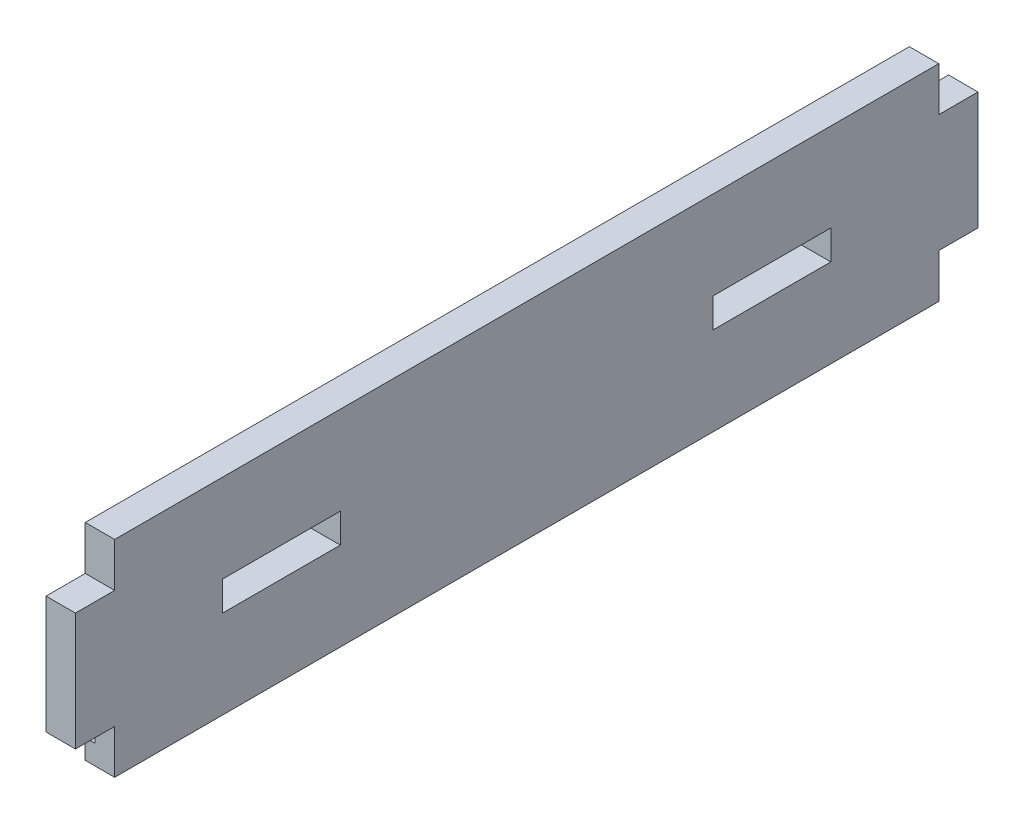
ISO-10303-21;
HEADER;
FILE_DESCRIPTION(('STEP AP214'),'2;1');
FILE_NAME('part.step','',(''),(''),'','','');
FILE_SCHEMA(('AUTOMOTIVE_DESIGN { 1 0 10303 214 1 1 1 1 }'));
ENDSEC;
DATA;
#1=APPLICATION_CONTEXT('core data for automotive mechanical design processes');
#2=APPLICATION_PROTOCOL_DEFINITION('international standard','automotive_design',2000,#1);
#3=PRODUCT_CONTEXT('',#1,'mechanical');
#4=PRODUCT('Part','Part','',(#3));
#5=PRODUCT_RELATED_PRODUCT_CATEGORY('part','',(#4));
#6=PRODUCT_DEFINITION_FORMATION('','',#4);
#7=PRODUCT_DEFINITION_CONTEXT('part definition',#1,'design');
#8=PRODUCT_DEFINITION('design','',#6,#7);
#9=PRODUCT_DEFINITION_SHAPE('','',#8);
#10=(LENGTH_UNIT() NAMED_UNIT(*) SI_UNIT(.MILLI.,.METRE.));
#11=(NAMED_UNIT(*) PLANE_ANGLE_UNIT() SI_UNIT($,.RADIAN.));
#12=(NAMED_UNIT(*) SI_UNIT($,.STERADIAN.) SOLID_ANGLE_UNIT());
#13=UNCERTAINTY_MEASURE_WITH_UNIT(LENGTH_MEASURE(1.E-05),#10,'distance_accuracy_value','');
#14=(GEOMETRIC_REPRESENTATION_CONTEXT(3) GLOBAL_UNCERTAINTY_ASSIGNED_CONTEXT((#13)) GLOBAL_UNIT_ASSIGNED_CONTEXT((#10,
#11,#12)) REPRESENTATION_CONTEXT('',''));
#15=CARTESIAN_POINT('',(0.,0.,0.));
#16=DIRECTION('',(0.,0.,1.));
#17=DIRECTION('',(1.,0.,0.));
#18=AXIS2_PLACEMENT_3D('',#15,#16,#17);
#19=CARTESIAN_POINT('',(49060.4061421849,709.389387363081,584.2));
#20=DIRECTION('',(1.,0.,0.));
#21=DIRECTION('',(0.,0.,-1.));
#22=AXIS2_PLACEMENT_3D('',#19,#20,#21);
#23=PLANE('',#22);
#24=DIRECTION('',(0.,0.,1.));
#25=VECTOR('',#24,1.);
#26=CARTESIAN_POINT('',(49060.4061421849,633.189387363082,95.25));
#27=LINE('',#26,#25);
#28=CARTESIAN_POINT('',(49060.4061421849,633.189387363082,95.25));
#29=VERTEX_POINT('',#28);
#30=CARTESIAN_POINT('',(49060.4061421849,633.189387363082,171.45));
#31=VERTEX_POINT('',#30);
#32=EDGE_CURVE('E324',#29,#31,#27,.T.);
#33=ORIENTED_EDGE('',*,*,#32,.F.);
#34=DIRECTION('',(0.,-1.,0.));
#35=VECTOR('',#34,1.);
#36=CARTESIAN_POINT('',(49060.4061421849,652.239387363081,95.25));
#37=LINE('',#36,#35);
#38=CARTESIAN_POINT('',(49060.4061421849,652.239387363081,95.25));
#39=VERTEX_POINT('',#38);
#40=EDGE_CURVE('E301',#39,#29,#37,.T.);
#41=ORIENTED_EDGE('',*,*,#40,.F.);
#42=DIRECTION('',(0.,0.,-1.));
#43=VECTOR('',#42,1.);
#44=CARTESIAN_POINT('',(49060.4061421849,652.239387363081,95.25));
#45=LINE('',#44,#43);
#46=CARTESIAN_POINT('',(49060.4061421849,652.239387363081,171.45));
#47=VERTEX_POINT('',#46);
#48=EDGE_CURVE('E313',#47,#39,#45,.T.);
#49=ORIENTED_EDGE('',*,*,#48,.F.);
#50=DIRECTION('',(0.,1.,0.));
#51=VECTOR('',#50,1.);
#52=CARTESIAN_POINT('',(49060.4061421849,652.239387363081,171.45));
#53=LINE('',#52,#51);
#54=EDGE_CURVE('E328',#31,#47,#53,.T.);
#55=ORIENTED_EDGE('',*,*,#54,.F.);
#56=EDGE_LOOP('',(#33,#41,#49,#55));
#57=FACE_BOUND('',#56,.T.);
#58=DIRECTION('',(0.,-1.,0.));
#59=VECTOR('',#58,1.);
#60=CARTESIAN_POINT('',(49060.4061421849,652.239387363081,412.75));
#61=LINE('',#60,#59);
#62=CARTESIAN_POINT('',(49060.4061421849,652.239387363081,412.75));
#63=VERTEX_POINT('',#62);
#64=CARTESIAN_POINT('',(49060.4061421849,633.189387363082,412.75));
#65=VERTEX_POINT('',#64);
#66=EDGE_CURVE('E290',#63,#65,#61,.T.);
#67=ORIENTED_EDGE('',*,*,#66,.F.);
#68=DIRECTION('',(0.,0.,-1.));
#69=VECTOR('',#68,1.);
#70=CARTESIAN_POINT('',(49060.4061421849,652.239387363081,488.95));
#71=LINE('',#70,#69);
#72=CARTESIAN_POINT('',(49060.4061421849,652.239387363081,488.95));
#73=VERTEX_POINT('',#72);
#74=EDGE_CURVE('E270',#73,#63,#71,.T.);
#75=ORIENTED_EDGE('',*,*,#74,.F.);
#76=DIRECTION('',(0.,1.,0.));
#77=VECTOR('',#76,1.);
#78=CARTESIAN_POINT('',(49060.4061421849,652.239387363081,488.95));
#79=LINE('',#78,#77);
#80=CARTESIAN_POINT('',(49060.4061421849,633.189387363082,488.95));
#81=VERTEX_POINT('',#80);
#82=EDGE_CURVE('E278',#81,#73,#79,.T.);
#83=ORIENTED_EDGE('',*,*,#82,.F.);
#84=DIRECTION('',(0.,0.,1.));
#85=VECTOR('',#84,1.);
#86=CARTESIAN_POINT('',(49060.4061421849,633.189387363082,488.95));
#87=LINE('',#86,#85);
#88=EDGE_CURVE('E294',#65,#81,#87,.T.);
#89=ORIENTED_EDGE('',*,*,#88,.F.);
#90=EDGE_LOOP('',(#67,#75,#83,#89));
#91=FACE_BOUND('',#90,.T.);
#92=DIRECTION('',(0.,1.,0.));
#93=VECTOR('',#92,1.);
#94=CARTESIAN_POINT('',(49060.4061421849,576.039387363082,25.4));
#95=LINE('',#94,#93);
#96=CARTESIAN_POINT('',(49060.4061421849,595.089387363082,25.4));
#97=VERTEX_POINT('',#96);
#98=CARTESIAN_POINT('',(49060.4061421849,604.614387363082,25.4));
#99=VERTEX_POINT('',#98);
#100=EDGE_CURVE('E220',#97,#99,#95,.T.);
#101=ORIENTED_EDGE('',*,*,#100,.F.);
#102=DIRECTION('',(0.,0.,1.));
#103=VECTOR('',#102,1.);
#104=CARTESIAN_POINT('',(49060.4061421849,595.089387363082,0.));
#105=LINE('',#104,#103);
#106=CARTESIAN_POINT('',(49060.4061421849,595.089387363082,558.8));
#107=VERTEX_POINT('',#106);
#108=EDGE_CURVE('E204',#97,#107,#105,.T.);
#109=ORIENTED_EDGE('',*,*,#108,.T.);
#110=DIRECTION('',(0.,-1.,0.));
#111=VECTOR('',#110,1.);
#112=CARTESIAN_POINT('',(49060.4061421849,576.039387363082,558.8));
#113=LINE('',#112,#111);
#114=CARTESIAN_POINT('',(49060.4061421849,604.614387363082,558.8));
#115=VERTEX_POINT('',#114);
#116=EDGE_CURVE('E397',#115,#107,#113,.T.);
#117=ORIENTED_EDGE('',*,*,#116,.F.);
#118=DIRECTION('',(0.,0.,-1.));
#119=VECTOR('',#118,1.);
#120=CARTESIAN_POINT('',(49060.4061421849,604.614387363082,584.2));
#121=LINE('',#120,#119);
#122=CARTESIAN_POINT('',(49060.4061421849,604.614387363082,584.2));
#123=VERTEX_POINT('',#122);
#124=EDGE_CURVE('E394',#123,#115,#121,.T.);
#125=ORIENTED_EDGE('',*,*,#124,.F.);
#126=DIRECTION('',(0.,-1.,0.));
#127=VECTOR('',#126,1.);
#128=CARTESIAN_POINT('',(49060.4061421849,709.389387363081,584.2));
#129=LINE('',#128,#127);
#130=CARTESIAN_POINT('',(49060.4061421849,680.814387363082,584.2));
#131=VERTEX_POINT('',#130);
#132=EDGE_CURVE('E344',#131,#123,#129,.T.);
#133=ORIENTED_EDGE('',*,*,#132,.F.);
#134=DIRECTION('',(0.,0.,1.));
#135=VECTOR('',#134,1.);
#136=CARTESIAN_POINT('',(49060.4061421849,680.814387363082,584.2));
#137=LINE('',#136,#135);
#138=CARTESIAN_POINT('',(49060.4061421849,680.814387363082,558.8));
#139=VERTEX_POINT('',#138);
#140=EDGE_CURVE('E241',#139,#131,#137,.T.);
#141=ORIENTED_EDGE('',*,*,#140,.F.);
#142=DIRECTION('',(0.,-1.,0.));
#143=VECTOR('',#142,1.);
#144=CARTESIAN_POINT('',(49060.4061421849,709.389387363081,558.8));
#145=LINE('',#144,#143);
#146=CARTESIAN_POINT('',(49060.4061421849,709.389387363081,558.8));
#147=VERTEX_POINT('',#146);
#148=EDGE_CURVE('E232',#147,#139,#145,.T.);
#149=ORIENTED_EDGE('',*,*,#148,.F.);
#150=DIRECTION('',(0.,0.,-1.));
#151=VECTOR('',#150,1.);
#152=CARTESIAN_POINT('',(49060.4061421849,709.389387363081,584.2));
#153=LINE('',#152,#151);
#154=CARTESIAN_POINT('',(49060.4061421849,709.389387363081,25.4));
#155=VERTEX_POINT('',#154);
#156=EDGE_CURVE('E352',#147,#155,#153,.T.);
#157=ORIENTED_EDGE('',*,*,#156,.T.);
#158=DIRECTION('',(0.,1.,0.));
#159=VECTOR('',#158,1.);
#160=CARTESIAN_POINT('',(49060.4061421849,709.389387363081,25.4));
#161=LINE('',#160,#159);
#162=CARTESIAN_POINT('',(49060.4061421849,680.814387363081,25.4));
#163=VERTEX_POINT('',#162);
#164=EDGE_CURVE('E259',#163,#155,#161,.T.);
#165=ORIENTED_EDGE('',*,*,#164,.F.);
#166=DIRECTION('',(0.,0.,1.));
#167=VECTOR('',#166,1.);
#168=CARTESIAN_POINT('',(49060.4061421849,680.814387363081,0.));
#169=LINE('',#168,#167);
#170=CARTESIAN_POINT('',(49060.4061421849,680.814387363081,0.));
#171=VERTEX_POINT('',#170);
#172=EDGE_CURVE('E251',#171,#163,#169,.T.);
#173=ORIENTED_EDGE('',*,*,#172,.F.);
#174=DIRECTION('',(0.,-1.,0.));
#175=VECTOR('',#174,1.);
#176=CARTESIAN_POINT('',(49060.4061421849,709.389387363081,0.));
#177=LINE('',#176,#175);
#178=CARTESIAN_POINT('',(49060.4061421849,604.614387363082,0.));
#179=VERTEX_POINT('',#178);
#180=EDGE_CURVE('E337',#171,#179,#177,.T.);
#181=ORIENTED_EDGE('',*,*,#180,.T.);
#182=DIRECTION('',(0.,0.,-1.));
#183=VECTOR('',#182,1.);
#184=CARTESIAN_POINT('',(49060.4061421849,604.614387363082,0.));
#185=LINE('',#184,#183);
#186=EDGE_CURVE('E219',#99,#179,#185,.T.);
#187=ORIENTED_EDGE('',*,*,#186,.F.);
#188=EDGE_LOOP('',(#101,#109,#117,#125,#133,#141,#149,#157,#165,#173,#181,#187));
#189=FACE_BOUND('',#188,.T.);
#190=ADVANCED_FACE('F36',(#57,#91,#189),#23,.F.);
#191=CARTESIAN_POINT('',(49060.4061421849,588.739387363082,558.8));
#192=VERTEX_POINT('',#191);
#193=CARTESIAN_POINT('',(49060.4061421849,576.039387363082,558.8));
#194=VERTEX_POINT('',#193);
#195=EDGE_CURVE('E211',#192,#194,#113,.T.);
#196=ORIENTED_EDGE('',*,*,#195,.F.);
#197=DIRECTION('',(0.,0.,1.));
#198=VECTOR('',#197,1.);
#199=CARTESIAN_POINT('',(49060.4061421849,588.739387363082,0.));
#200=LINE('',#199,#198);
#201=CARTESIAN_POINT('',(49060.4061421849,588.739387363082,25.4));
#202=VERTEX_POINT('',#201);
#203=EDGE_CURVE('E51',#202,#192,#200,.T.);
#204=ORIENTED_EDGE('',*,*,#203,.F.);
#205=CARTESIAN_POINT('',(49060.4061421849,576.039387363082,25.4));
#206=VERTEX_POINT('',#205);
#207=EDGE_CURVE('E210',#206,#202,#95,.T.);
#208=ORIENTED_EDGE('',*,*,#207,.F.);
#209=DIRECTION('',(0.,0.,-1.));
#210=VECTOR('',#209,1.);
#211=CARTESIAN_POINT('',(49060.4061421849,576.039387363081,584.2));
#212=LINE('',#211,#210);
#213=EDGE_CURVE('E366',#194,#206,#212,.T.);
#214=ORIENTED_EDGE('',*,*,#213,.F.);
#215=EDGE_LOOP('',(#196,#204,#208,#214));
#216=FACE_BOUND('',#215,.T.);
#217=ADVANCED_FACE('F38',(#216),#23,.F.);
#218=CARTESIAN_POINT('',(49060.4061421849,576.039387363081,584.2));
#219=DIRECTION('',(0.,1.,0.));
#220=DIRECTION('',(0.,0.,1.));
#221=AXIS2_PLACEMENT_3D('',#218,#219,#220);
#222=PLANE('',#221);
#223=DIRECTION('',(0.,0.,-1.));
#224=VECTOR('',#223,1.);
#225=CARTESIAN_POINT('',(49079.4561421849,576.039387363081,584.2));
#226=LINE('',#225,#224);
#227=CARTESIAN_POINT('',(49079.4561421849,576.039387363082,558.8));
#228=VERTEX_POINT('',#227);
#229=CARTESIAN_POINT('',(49079.4561421849,576.039387363082,25.4));
#230=VERTEX_POINT('',#229);
#231=EDGE_CURVE('E363',#228,#230,#226,.T.);
#232=ORIENTED_EDGE('',*,*,#231,.F.);
#233=DIRECTION('',(-1.,0.,0.));
#234=VECTOR('',#233,1.);
#235=CARTESIAN_POINT('',(49079.4561421849,576.039387363082,558.8));
#236=LINE('',#235,#234);
#237=EDGE_CURVE('E224',#228,#194,#236,.T.);
#238=ORIENTED_EDGE('',*,*,#237,.T.);
#239=ORIENTED_EDGE('',*,*,#213,.T.);
#240=DIRECTION('',(-1.,0.,0.));
#241=VECTOR('',#240,1.);
#242=CARTESIAN_POINT('',(49079.4561421849,576.039387363082,25.4));
#243=LINE('',#242,#241);
#244=EDGE_CURVE('E218',#230,#206,#243,.T.);
#245=ORIENTED_EDGE('',*,*,#244,.F.);
#246=EDGE_LOOP('',(#232,#238,#239,#245));
#247=FACE_BOUND('',#246,.T.);
#248=ADVANCED_FACE('F454',(#247),#222,.F.);
#249=CARTESIAN_POINT('',(49079.4561421849,709.389387363081,584.2));
#250=DIRECTION('',(-1.,0.,0.));
#251=DIRECTION('',(0.,0.,1.));
#252=AXIS2_PLACEMENT_3D('',#249,#250,#251);
#253=PLANE('',#252);
#254=DIRECTION('',(0.,1.,0.));
#255=VECTOR('',#254,1.);
#256=CARTESIAN_POINT('',(49079.4561421849,652.239387363081,488.95));
#257=LINE('',#256,#255);
#258=CARTESIAN_POINT('',(49079.4561421849,633.189387363082,488.95));
#259=VERTEX_POINT('',#258);
#260=CARTESIAN_POINT('',(49079.4561421849,652.239387363081,488.95));
#261=VERTEX_POINT('',#260);
#262=EDGE_CURVE('E285',#259,#261,#257,.T.);
#263=ORIENTED_EDGE('',*,*,#262,.T.);
#264=DIRECTION('',(0.,0.,-1.));
#265=VECTOR('',#264,1.);
#266=CARTESIAN_POINT('',(49079.4561421849,652.239387363081,488.95));
#267=LINE('',#266,#265);
#268=CARTESIAN_POINT('',(49079.4561421849,652.239387363081,412.75));
#269=VERTEX_POINT('',#268);
#270=EDGE_CURVE('E274',#261,#269,#267,.T.);
#271=ORIENTED_EDGE('',*,*,#270,.T.);
#272=DIRECTION('',(0.,-1.,0.));
#273=VECTOR('',#272,1.);
#274=CARTESIAN_POINT('',(49079.4561421849,652.239387363081,412.75));
#275=LINE('',#274,#273);
#276=CARTESIAN_POINT('',(49079.4561421849,633.189387363082,412.75));
#277=VERTEX_POINT('',#276);
#278=EDGE_CURVE('E277',#269,#277,#275,.T.);
#279=ORIENTED_EDGE('',*,*,#278,.T.);
#280=DIRECTION('',(0.,0.,1.));
#281=VECTOR('',#280,1.);
#282=CARTESIAN_POINT('',(49079.4561421849,633.189387363082,488.95));
#283=LINE('',#282,#281);
#284=EDGE_CURVE('E282',#277,#259,#283,.T.);
#285=ORIENTED_EDGE('',*,*,#284,.T.);
#286=EDGE_LOOP('',(#263,#271,#279,#285));
#287=FACE_BOUND('',#286,.T.);
#288=DIRECTION('',(0.,0.,-1.));
#289=VECTOR('',#288,1.);
#290=CARTESIAN_POINT('',(49079.4561421849,652.239387363081,95.25));
#291=LINE('',#290,#289);
#292=CARTESIAN_POINT('',(49079.4561421849,652.239387363081,171.45));
#293=VERTEX_POINT('',#292);
#294=CARTESIAN_POINT('',(49079.4561421849,652.239387363081,95.25));
#295=VERTEX_POINT('',#294);
#296=EDGE_CURVE('E319',#293,#295,#291,.T.);
#297=ORIENTED_EDGE('',*,*,#296,.T.);
#298=DIRECTION('',(0.,-1.,0.));
#299=VECTOR('',#298,1.);
#300=CARTESIAN_POINT('',(49079.4561421849,652.239387363081,95.25));
#301=LINE('',#300,#299);
#302=CARTESIAN_POINT('',(49079.4561421849,633.189387363082,95.25));
#303=VERTEX_POINT('',#302);
#304=EDGE_CURVE('E308',#295,#303,#301,.T.);
#305=ORIENTED_EDGE('',*,*,#304,.T.);
#306=DIRECTION('',(0.,0.,1.));
#307=VECTOR('',#306,1.);
#308=CARTESIAN_POINT('',(49079.4561421849,633.189387363082,95.25));
#309=LINE('',#308,#307);
#310=CARTESIAN_POINT('',(49079.4561421849,633.189387363082,171.45));
#311=VERTEX_POINT('',#310);
#312=EDGE_CURVE('E312',#303,#311,#309,.T.);
#313=ORIENTED_EDGE('',*,*,#312,.T.);
#314=DIRECTION('',(0.,1.,0.));
#315=VECTOR('',#314,1.);
#316=CARTESIAN_POINT('',(49079.4561421849,652.239387363081,171.45));
#317=LINE('',#316,#315);
#318=EDGE_CURVE('E316',#311,#293,#317,.T.);
#319=ORIENTED_EDGE('',*,*,#318,.T.);
#320=EDGE_LOOP('',(#297,#305,#313,#319));
#321=FACE_BOUND('',#320,.T.);
#322=DIRECTION('',(0.,0.,-1.));
#323=VECTOR('',#322,1.);
#324=CARTESIAN_POINT('',(49079.4561421849,604.614387363082,584.2));
#325=LINE('',#324,#323);
#326=CARTESIAN_POINT('',(49079.4561421849,604.614387363082,584.2));
#327=VERTEX_POINT('',#326);
#328=CARTESIAN_POINT('',(49079.4561421849,604.614387363082,558.8));
#329=VERTEX_POINT('',#328);
#330=EDGE_CURVE('E59',#327,#329,#325,.T.);
#331=ORIENTED_EDGE('',*,*,#330,.T.);
#332=DIRECTION('',(0.,-1.,0.));
#333=VECTOR('',#332,1.);
#334=CARTESIAN_POINT('',(49079.4561421849,576.039387363082,558.8));
#335=LINE('',#334,#333);
#336=EDGE_CURVE('E396',#329,#228,#335,.T.);
#337=ORIENTED_EDGE('',*,*,#336,.T.);
#338=ORIENTED_EDGE('',*,*,#231,.T.);
#339=DIRECTION('',(0.,1.,0.));
#340=VECTOR('',#339,1.);
#341=CARTESIAN_POINT('',(49079.4561421849,576.039387363082,25.4));
#342=LINE('',#341,#340);
#343=CARTESIAN_POINT('',(49079.4561421849,604.614387363082,25.4));
#344=VERTEX_POINT('',#343);
#345=EDGE_CURVE('E222',#230,#344,#342,.T.);
#346=ORIENTED_EDGE('',*,*,#345,.T.);
#347=DIRECTION('',(0.,0.,-1.));
#348=VECTOR('',#347,1.);
#349=CARTESIAN_POINT('',(49079.4561421849,604.614387363082,0.));
#350=LINE('',#349,#348);
#351=CARTESIAN_POINT('',(49079.4561421849,604.614387363082,0.));
#352=VERTEX_POINT('',#351);
#353=EDGE_CURVE('E226',#344,#352,#350,.T.);
#354=ORIENTED_EDGE('',*,*,#353,.T.);
#355=DIRECTION('',(0.,1.,0.));
#356=VECTOR('',#355,1.);
#357=CARTESIAN_POINT('',(49079.4561421849,709.389387363081,0.));
#358=LINE('',#357,#356);
#359=CARTESIAN_POINT('',(49079.4561421849,680.814387363081,0.));
#360=VERTEX_POINT('',#359);
#361=EDGE_CURVE('E349',#352,#360,#358,.T.);
#362=ORIENTED_EDGE('',*,*,#361,.T.);
#363=DIRECTION('',(0.,0.,1.));
#364=VECTOR('',#363,1.);
#365=CARTESIAN_POINT('',(49079.4561421849,680.814387363081,0.));
#366=LINE('',#365,#364);
#367=CARTESIAN_POINT('',(49079.4561421849,680.814387363081,25.4));
#368=VERTEX_POINT('',#367);
#369=EDGE_CURVE('E255',#360,#368,#366,.T.);
#370=ORIENTED_EDGE('',*,*,#369,.T.);
#371=DIRECTION('',(0.,1.,0.));
#372=VECTOR('',#371,1.);
#373=CARTESIAN_POINT('',(49079.4561421849,709.389387363081,25.4));
#374=LINE('',#373,#372);
#375=CARTESIAN_POINT('',(49079.4561421849,709.389387363081,25.4));
#376=VERTEX_POINT('',#375);
#377=EDGE_CURVE('E258',#368,#376,#374,.T.);
#378=ORIENTED_EDGE('',*,*,#377,.T.);
#379=DIRECTION('',(0.,0.,-1.));
#380=VECTOR('',#379,1.);
#381=CARTESIAN_POINT('',(49079.4561421849,709.389387363081,584.2));
#382=LINE('',#381,#380);
#383=CARTESIAN_POINT('',(49079.4561421849,709.389387363081,558.8));
#384=VERTEX_POINT('',#383);
#385=EDGE_CURVE('E360',#384,#376,#382,.T.);
#386=ORIENTED_EDGE('',*,*,#385,.F.);
#387=DIRECTION('',(0.,-1.,0.));
#388=VECTOR('',#387,1.);
#389=CARTESIAN_POINT('',(49079.4561421849,709.389387363081,558.8));
#390=LINE('',#389,#388);
#391=CARTESIAN_POINT('',(49079.4561421849,680.814387363082,558.8));
#392=VERTEX_POINT('',#391);
#393=EDGE_CURVE('E237',#384,#392,#390,.T.);
#394=ORIENTED_EDGE('',*,*,#393,.T.);
#395=DIRECTION('',(0.,0.,1.));
#396=VECTOR('',#395,1.);
#397=CARTESIAN_POINT('',(49079.4561421849,680.814387363082,584.2));
#398=LINE('',#397,#396);
#399=CARTESIAN_POINT('',(49079.4561421849,680.814387363082,584.2));
#400=VERTEX_POINT('',#399);
#401=EDGE_CURVE('E240',#392,#400,#398,.T.);
#402=ORIENTED_EDGE('',*,*,#401,.T.);
#403=DIRECTION('',(0.,1.,0.));
#404=VECTOR('',#403,1.);
#405=CARTESIAN_POINT('',(49079.4561421849,709.389387363081,584.2));
#406=LINE('',#405,#404);
#407=EDGE_CURVE('E348',#327,#400,#406,.T.);
#408=ORIENTED_EDGE('',*,*,#407,.F.);
#409=EDGE_LOOP('',(#331,#337,#338,#346,#354,#362,#370,#378,#386,#394,#402,#408));
#410=FACE_BOUND('',#409,.T.);
#411=ADVANCED_FACE('F413',(#287,#321,#410),#253,.F.);
#412=CARTESIAN_POINT('',(49060.4061421849,709.389387363081,584.2));
#413=DIRECTION('',(0.,-1.,0.));
#414=DIRECTION('',(0.,0.,-1.));
#415=AXIS2_PLACEMENT_3D('',#412,#413,#414);
#416=PLANE('',#415);
#417=ORIENTED_EDGE('',*,*,#156,.F.);
#418=DIRECTION('',(-1.,0.,0.));
#419=VECTOR('',#418,1.);
#420=CARTESIAN_POINT('',(49079.4561421849,709.389387363081,558.8));
#421=LINE('',#420,#419);
#422=EDGE_CURVE('E244',#384,#147,#421,.T.);
#423=ORIENTED_EDGE('',*,*,#422,.F.);
#424=ORIENTED_EDGE('',*,*,#385,.T.);
#425=DIRECTION('',(-1.,0.,0.));
#426=VECTOR('',#425,1.);
#427=CARTESIAN_POINT('',(49079.4561421849,709.389387363081,25.4));
#428=LINE('',#427,#426);
#429=EDGE_CURVE('E267',#376,#155,#428,.T.);
#430=ORIENTED_EDGE('',*,*,#429,.T.);
#431=EDGE_LOOP('',(#417,#423,#424,#430));
#432=FACE_BOUND('',#431,.T.);
#433=ADVANCED_FACE('F434',(#432),#416,.F.);
#434=CARTESIAN_POINT('',(0.,0.,584.2));
#435=DIRECTION('',(0.,0.,1.));
#436=DIRECTION('',(1.,0.,0.));
#437=AXIS2_PLACEMENT_3D('',#434,#435,#436);
#438=PLANE('',#437);
#439=DIRECTION('',(-1.,0.,0.));
#440=VECTOR('',#439,1.);
#441=CARTESIAN_POINT('',(49079.4561421849,604.614387363082,584.2));
#442=LINE('',#441,#440);
#443=EDGE_CURVE('E400',#327,#123,#442,.T.);
#444=ORIENTED_EDGE('',*,*,#443,.F.);
#445=ORIENTED_EDGE('',*,*,#407,.T.);
#446=DIRECTION('',(-1.,0.,0.));
#447=VECTOR('',#446,1.);
#448=CARTESIAN_POINT('',(49079.4561421849,680.814387363082,584.2));
#449=LINE('',#448,#447);
#450=EDGE_CURVE('E248',#400,#131,#449,.T.);
#451=ORIENTED_EDGE('',*,*,#450,.T.);
#452=ORIENTED_EDGE('',*,*,#132,.T.);
#453=EDGE_LOOP('',(#444,#445,#451,#452));
#454=FACE_BOUND('',#453,.T.);
#455=ADVANCED_FACE('F447',(#454),#438,.T.);
#456=CARTESIAN_POINT('',(0.,0.,0.));
#457=DIRECTION('',(0.,0.,1.));
#458=DIRECTION('',(1.,0.,0.));
#459=AXIS2_PLACEMENT_3D('',#456,#457,#458);
#460=PLANE('',#459);
#461=ORIENTED_EDGE('',*,*,#361,.F.);
#462=DIRECTION('',(-1.,0.,0.));
#463=VECTOR('',#462,1.);
#464=CARTESIAN_POINT('',(49079.4561421849,604.614387363082,0.));
#465=LINE('',#464,#463);
#466=EDGE_CURVE('E229',#352,#179,#465,.T.);
#467=ORIENTED_EDGE('',*,*,#466,.T.);
#468=ORIENTED_EDGE('',*,*,#180,.F.);
#469=DIRECTION('',(-1.,0.,0.));
#470=VECTOR('',#469,1.);
#471=CARTESIAN_POINT('',(49079.4561421849,680.814387363081,0.));
#472=LINE('',#471,#470);
#473=EDGE_CURVE('E262',#360,#171,#472,.T.);
#474=ORIENTED_EDGE('',*,*,#473,.F.);
#475=EDGE_LOOP('',(#461,#467,#468,#474));
#476=FACE_BOUND('',#475,.T.);
#477=ADVANCED_FACE('F418',(#476),#460,.F.);
#478=CARTESIAN_POINT('',(49079.4561421849,652.239387363081,95.25));
#479=DIRECTION('',(0.,0.,-1.));
#480=DIRECTION('',(-1.,0.,0.));
#481=AXIS2_PLACEMENT_3D('',#478,#479,#480);
#482=PLANE('',#481);
#483=ORIENTED_EDGE('',*,*,#40,.T.);
#484=DIRECTION('',(-1.,0.,0.));
#485=VECTOR('',#484,1.);
#486=CARTESIAN_POINT('',(49079.4561421849,633.189387363082,95.25));
#487=LINE('',#486,#485);
#488=EDGE_CURVE('E322',#303,#29,#487,.T.);
#489=ORIENTED_EDGE('',*,*,#488,.F.);
#490=ORIENTED_EDGE('',*,*,#304,.F.);
#491=DIRECTION('',(-1.,0.,0.));
#492=VECTOR('',#491,1.);
#493=CARTESIAN_POINT('',(49079.4561421849,652.239387363081,95.25));
#494=LINE('',#493,#492);
#495=EDGE_CURVE('E334',#295,#39,#494,.T.);
#496=ORIENTED_EDGE('',*,*,#495,.T.);
#497=EDGE_LOOP('',(#483,#489,#490,#496));
#498=FACE_BOUND('',#497,.T.);
#499=ADVANCED_FACE('F493',(#498),#482,.F.);
#500=CARTESIAN_POINT('',(49079.4561421849,652.239387363081,95.25));
#501=DIRECTION('',(0.,1.,0.));
#502=DIRECTION('',(0.,0.,1.));
#503=AXIS2_PLACEMENT_3D('',#500,#501,#502);
#504=PLANE('',#503);
#505=ORIENTED_EDGE('',*,*,#48,.T.);
#506=ORIENTED_EDGE('',*,*,#495,.F.);
#507=ORIENTED_EDGE('',*,*,#296,.F.);
#508=DIRECTION('',(-1.,0.,0.));
#509=VECTOR('',#508,1.);
#510=CARTESIAN_POINT('',(49079.4561421849,652.239387363081,171.45));
#511=LINE('',#510,#509);
#512=EDGE_CURVE('E338',#293,#47,#511,.T.);
#513=ORIENTED_EDGE('',*,*,#512,.T.);
#514=EDGE_LOOP('',(#505,#506,#507,#513));
#515=FACE_BOUND('',#514,.T.);
#516=ADVANCED_FACE('F490',(#515),#504,.F.);
#517=CARTESIAN_POINT('',(49079.4561421849,652.239387363081,171.45));
#518=DIRECTION('',(0.,0.,1.));
#519=DIRECTION('',(0.,-1.,0.));
#520=AXIS2_PLACEMENT_3D('',#517,#518,#519);
#521=PLANE('',#520);
#522=ORIENTED_EDGE('',*,*,#54,.T.);
#523=ORIENTED_EDGE('',*,*,#512,.F.);
#524=ORIENTED_EDGE('',*,*,#318,.F.);
#525=DIRECTION('',(-1.,0.,0.));
#526=VECTOR('',#525,1.);
#527=CARTESIAN_POINT('',(49079.4561421849,633.189387363082,171.45));
#528=LINE('',#527,#526);
#529=EDGE_CURVE('E340',#311,#31,#528,.T.);
#530=ORIENTED_EDGE('',*,*,#529,.T.);
#531=EDGE_LOOP('',(#522,#523,#524,#530));
#532=FACE_BOUND('',#531,.T.);
#533=ADVANCED_FACE('F499',(#532),#521,.F.);
#534=CARTESIAN_POINT('',(49079.4561421849,633.189387363082,95.25));
#535=DIRECTION('',(0.,-1.,0.));
#536=DIRECTION('',(0.,0.,-1.));
#537=AXIS2_PLACEMENT_3D('',#534,#535,#536);
#538=PLANE('',#537);
#539=ORIENTED_EDGE('',*,*,#32,.T.);
#540=ORIENTED_EDGE('',*,*,#529,.F.);
#541=ORIENTED_EDGE('',*,*,#312,.F.);
#542=ORIENTED_EDGE('',*,*,#488,.T.);
#543=EDGE_LOOP('',(#539,#540,#541,#542));
#544=FACE_BOUND('',#543,.T.);
#545=ADVANCED_FACE('F497',(#544),#538,.F.);
#546=CARTESIAN_POINT('',(49079.4561421849,652.239387363081,488.95));
#547=DIRECTION('',(0.,1.,0.));
#548=DIRECTION('',(0.,0.,1.));
#549=AXIS2_PLACEMENT_3D('',#546,#547,#548);
#550=PLANE('',#549);
#551=ORIENTED_EDGE('',*,*,#74,.T.);
#552=DIRECTION('',(-1.,0.,0.));
#553=VECTOR('',#552,1.);
#554=CARTESIAN_POINT('',(49079.4561421849,652.239387363081,412.75));
#555=LINE('',#554,#553);
#556=EDGE_CURVE('E288',#269,#63,#555,.T.);
#557=ORIENTED_EDGE('',*,*,#556,.F.);
#558=ORIENTED_EDGE('',*,*,#270,.F.);
#559=DIRECTION('',(-1.,0.,0.));
#560=VECTOR('',#559,1.);
#561=CARTESIAN_POINT('',(49079.4561421849,652.239387363081,488.95));
#562=LINE('',#561,#560);
#563=EDGE_CURVE('E299',#261,#73,#562,.T.);
#564=ORIENTED_EDGE('',*,*,#563,.T.);
#565=EDGE_LOOP('',(#551,#557,#558,#564));
#566=FACE_BOUND('',#565,.T.);
#567=ADVANCED_FACE('F480',(#566),#550,.F.);
#568=CARTESIAN_POINT('',(49079.4561421849,652.239387363081,488.95));
#569=DIRECTION('',(0.,0.,1.));
#570=DIRECTION('',(1.,0.,0.));
#571=AXIS2_PLACEMENT_3D('',#568,#569,#570);
#572=PLANE('',#571);
#573=ORIENTED_EDGE('',*,*,#82,.T.);
#574=ORIENTED_EDGE('',*,*,#563,.F.);
#575=ORIENTED_EDGE('',*,*,#262,.F.);
#576=DIRECTION('',(-1.,0.,0.));
#577=VECTOR('',#576,1.);
#578=CARTESIAN_POINT('',(49079.4561421849,633.189387363082,488.95));
#579=LINE('',#578,#577);
#580=EDGE_CURVE('E302',#259,#81,#579,.T.);
#581=ORIENTED_EDGE('',*,*,#580,.T.);
#582=EDGE_LOOP('',(#573,#574,#575,#581));
#583=FACE_BOUND('',#582,.T.);
#584=ADVANCED_FACE('F483',(#583),#572,.F.);
#585=CARTESIAN_POINT('',(49079.4561421849,633.189387363082,488.95));
#586=DIRECTION('',(0.,-1.,0.));
#587=DIRECTION('',(0.,0.,-1.));
#588=AXIS2_PLACEMENT_3D('',#585,#586,#587);
#589=PLANE('',#588);
#590=ORIENTED_EDGE('',*,*,#88,.T.);
#591=ORIENTED_EDGE('',*,*,#580,.F.);
#592=ORIENTED_EDGE('',*,*,#284,.F.);
#593=DIRECTION('',(-1.,0.,0.));
#594=VECTOR('',#593,1.);
#595=CARTESIAN_POINT('',(49079.4561421849,633.189387363082,412.75));
#596=LINE('',#595,#594);
#597=EDGE_CURVE('E304',#277,#65,#596,.T.);
#598=ORIENTED_EDGE('',*,*,#597,.T.);
#599=EDGE_LOOP('',(#590,#591,#592,#598));
#600=FACE_BOUND('',#599,.T.);
#601=ADVANCED_FACE('F485',(#600),#589,.F.);
#602=CARTESIAN_POINT('',(49079.4561421849,652.239387363081,412.75));
#603=DIRECTION('',(0.,0.,-1.));
#604=DIRECTION('',(-1.,0.,0.));
#605=AXIS2_PLACEMENT_3D('',#602,#603,#604);
#606=PLANE('',#605);
#607=ORIENTED_EDGE('',*,*,#66,.T.);
#608=ORIENTED_EDGE('',*,*,#597,.F.);
#609=ORIENTED_EDGE('',*,*,#278,.F.);
#610=ORIENTED_EDGE('',*,*,#556,.T.);
#611=EDGE_LOOP('',(#607,#608,#609,#610));
#612=FACE_BOUND('',#611,.T.);
#613=ADVANCED_FACE('F476',(#612),#606,.F.);
#614=CARTESIAN_POINT('',(49079.4561421849,709.389387363081,25.4));
#615=DIRECTION('',(0.,0.,1.));
#616=DIRECTION('',(0.,-1.,0.));
#617=AXIS2_PLACEMENT_3D('',#614,#615,#616);
#618=PLANE('',#617);
#619=ORIENTED_EDGE('',*,*,#164,.T.);
#620=ORIENTED_EDGE('',*,*,#429,.F.);
#621=ORIENTED_EDGE('',*,*,#377,.F.);
#622=DIRECTION('',(-1.,0.,0.));
#623=VECTOR('',#622,1.);
#624=CARTESIAN_POINT('',(49079.4561421849,680.814387363081,25.4));
#625=LINE('',#624,#623);
#626=EDGE_CURVE('E271',#368,#163,#625,.T.);
#627=ORIENTED_EDGE('',*,*,#626,.T.);
#628=EDGE_LOOP('',(#619,#620,#621,#627));
#629=FACE_BOUND('',#628,.T.);
#630=ADVANCED_FACE('F431',(#629),#618,.F.);
#631=CARTESIAN_POINT('',(49079.4561421849,680.814387363081,0.));
#632=DIRECTION('',(0.,-1.,0.));
#633=DIRECTION('',(0.,0.,-1.));
#634=AXIS2_PLACEMENT_3D('',#631,#632,#633);
#635=PLANE('',#634);
#636=ORIENTED_EDGE('',*,*,#172,.T.);
#637=ORIENTED_EDGE('',*,*,#626,.F.);
#638=ORIENTED_EDGE('',*,*,#369,.F.);
#639=ORIENTED_EDGE('',*,*,#473,.T.);
#640=EDGE_LOOP('',(#636,#637,#638,#639));
#641=FACE_BOUND('',#640,.T.);
#642=ADVANCED_FACE('F422',(#641),#635,.F.);
#643=CARTESIAN_POINT('',(49079.4561421849,680.814387363082,584.2));
#644=DIRECTION('',(0.,-1.,0.));
#645=DIRECTION('',(0.,0.,-1.));
#646=AXIS2_PLACEMENT_3D('',#643,#644,#645);
#647=PLANE('',#646);
#648=ORIENTED_EDGE('',*,*,#140,.T.);
#649=ORIENTED_EDGE('',*,*,#450,.F.);
#650=ORIENTED_EDGE('',*,*,#401,.F.);
#651=DIRECTION('',(-1.,0.,0.));
#652=VECTOR('',#651,1.);
#653=CARTESIAN_POINT('',(49079.4561421849,680.814387363082,558.8));
#654=LINE('',#653,#652);
#655=EDGE_CURVE('E252',#392,#139,#654,.T.);
#656=ORIENTED_EDGE('',*,*,#655,.T.);
#657=EDGE_LOOP('',(#648,#649,#650,#656));
#658=FACE_BOUND('',#657,.T.);
#659=ADVANCED_FACE('F444',(#658),#647,.F.);
#660=CARTESIAN_POINT('',(49079.4561421849,709.389387363081,558.8));
#661=DIRECTION('',(0.,0.,-1.));
#662=DIRECTION('',(-1.,0.,0.));
#663=AXIS2_PLACEMENT_3D('',#660,#661,#662);
#664=PLANE('',#663);
#665=ORIENTED_EDGE('',*,*,#148,.T.);
#666=ORIENTED_EDGE('',*,*,#655,.F.);
#667=ORIENTED_EDGE('',*,*,#393,.F.);
#668=ORIENTED_EDGE('',*,*,#422,.T.);
#669=EDGE_LOOP('',(#665,#666,#667,#668));
#670=FACE_BOUND('',#669,.T.);
#671=ADVANCED_FACE('F440',(#670),#664,.F.);
#672=CARTESIAN_POINT('',(49079.4561421849,604.614387363082,0.));
#673=DIRECTION('',(0.,1.,0.));
#674=DIRECTION('',(0.,0.,1.));
#675=AXIS2_PLACEMENT_3D('',#672,#673,#674);
#676=PLANE('',#675);
#677=ORIENTED_EDGE('',*,*,#186,.T.);
#678=ORIENTED_EDGE('',*,*,#466,.F.);
#679=ORIENTED_EDGE('',*,*,#353,.F.);
#680=DIRECTION('',(-1.,0.,0.));
#681=VECTOR('',#680,1.);
#682=CARTESIAN_POINT('',(49079.4561421849,604.614387363082,25.4));
#683=LINE('',#682,#681);
#684=EDGE_CURVE('E233',#344,#99,#683,.T.);
#685=ORIENTED_EDGE('',*,*,#684,.T.);
#686=EDGE_LOOP('',(#677,#678,#679,#685));
#687=FACE_BOUND('',#686,.T.);
#688=ADVANCED_FACE('F612',(#687),#676,.F.);
#689=CARTESIAN_POINT('',(49079.4561421849,576.039387363082,25.4));
#690=DIRECTION('',(0.,0.,1.));
#691=DIRECTION('',(0.,-1.,0.));
#692=AXIS2_PLACEMENT_3D('',#689,#690,#691);
#693=PLANE('',#692);
#694=DIRECTION('',(0.,1.,0.));
#695=VECTOR('',#694,1.);
#696=CARTESIAN_POINT('',(49066.7561421849,576.039387363082,25.4));
#697=LINE('',#696,#695);
#698=CARTESIAN_POINT('',(49066.7561421849,588.739387363082,25.4));
#699=VERTEX_POINT('',#698);
#700=CARTESIAN_POINT('',(49066.7561421849,595.089387363082,25.4));
#701=VERTEX_POINT('',#700);
#702=EDGE_CURVE('E203',#699,#701,#697,.T.);
#703=ORIENTED_EDGE('',*,*,#702,.T.);
#704=DIRECTION('',(-1.,0.,0.));
#705=VECTOR('',#704,1.);
#706=CARTESIAN_POINT('',(49079.4561421849,595.089387363082,25.4));
#707=LINE('',#706,#705);
#708=EDGE_CURVE('E383',#701,#97,#707,.T.);
#709=ORIENTED_EDGE('',*,*,#708,.T.);
#710=ORIENTED_EDGE('',*,*,#100,.T.);
#711=ORIENTED_EDGE('',*,*,#684,.F.);
#712=ORIENTED_EDGE('',*,*,#345,.F.);
#713=ORIENTED_EDGE('',*,*,#244,.T.);
#714=ORIENTED_EDGE('',*,*,#207,.T.);
#715=DIRECTION('',(1.,0.,0.));
#716=VECTOR('',#715,1.);
#717=CARTESIAN_POINT('',(49079.4561421849,588.739387363082,25.4));
#718=LINE('',#717,#716);
#719=EDGE_CURVE('E196',#202,#699,#718,.T.);
#720=ORIENTED_EDGE('',*,*,#719,.T.);
#721=EDGE_LOOP('',(#703,#709,#710,#711,#712,#713,#714,#720));
#722=FACE_BOUND('',#721,.T.);
#723=ADVANCED_FACE('F215',(#722),#693,.F.);
#724=CARTESIAN_POINT('',(49079.4561421849,576.039387363082,558.8));
#725=DIRECTION('',(0.,0.,-1.));
#726=DIRECTION('',(-1.,0.,0.));
#727=AXIS2_PLACEMENT_3D('',#724,#725,#726);
#728=PLANE('',#727);
#729=ORIENTED_EDGE('',*,*,#116,.T.);
#730=DIRECTION('',(1.,0.,0.));
#731=VECTOR('',#730,1.);
#732=CARTESIAN_POINT('',(49079.4561421849,595.089387363082,558.8));
#733=LINE('',#732,#731);
#734=CARTESIAN_POINT('',(49066.7561421849,595.089387363082,558.8));
#735=VERTEX_POINT('',#734);
#736=EDGE_CURVE('E12',#107,#735,#733,.T.);
#737=ORIENTED_EDGE('',*,*,#736,.T.);
#738=DIRECTION('',(0.,-1.,0.));
#739=VECTOR('',#738,1.);
#740=CARTESIAN_POINT('',(49066.7561421849,576.039387363082,558.8));
#741=LINE('',#740,#739);
#742=CARTESIAN_POINT('',(49066.7561421849,588.739387363082,558.8));
#743=VERTEX_POINT('',#742);
#744=EDGE_CURVE('E44',#735,#743,#741,.T.);
#745=ORIENTED_EDGE('',*,*,#744,.T.);
#746=DIRECTION('',(-1.,0.,0.));
#747=VECTOR('',#746,1.);
#748=CARTESIAN_POINT('',(49079.4561421849,588.739387363082,558.8));
#749=LINE('',#748,#747);
#750=EDGE_CURVE('E369',#743,#192,#749,.T.);
#751=ORIENTED_EDGE('',*,*,#750,.T.);
#752=ORIENTED_EDGE('',*,*,#195,.T.);
#753=ORIENTED_EDGE('',*,*,#237,.F.);
#754=ORIENTED_EDGE('',*,*,#336,.F.);
#755=DIRECTION('',(-1.,0.,0.));
#756=VECTOR('',#755,1.);
#757=CARTESIAN_POINT('',(49079.4561421849,604.614387363082,558.8));
#758=LINE('',#757,#756);
#759=EDGE_CURVE('E406',#329,#115,#758,.T.);
#760=ORIENTED_EDGE('',*,*,#759,.T.);
#761=EDGE_LOOP('',(#729,#737,#745,#751,#752,#753,#754,#760));
#762=FACE_BOUND('',#761,.T.);
#763=ADVANCED_FACE('F373',(#762),#728,.F.);
#764=CARTESIAN_POINT('',(49079.4561421849,604.614387363082,584.2));
#765=DIRECTION('',(0.,1.,0.));
#766=DIRECTION('',(0.,0.,1.));
#767=AXIS2_PLACEMENT_3D('',#764,#765,#766);
#768=PLANE('',#767);
#769=ORIENTED_EDGE('',*,*,#124,.T.);
#770=ORIENTED_EDGE('',*,*,#759,.F.);
#771=ORIENTED_EDGE('',*,*,#330,.F.);
#772=ORIENTED_EDGE('',*,*,#443,.T.);
#773=EDGE_LOOP('',(#769,#770,#771,#772));
#774=FACE_BOUND('',#773,.T.);
#775=ADVANCED_FACE('F450',(#774),#768,.F.);
#776=CARTESIAN_POINT('',(49060.4061421849,595.089387363082,0.));
#777=DIRECTION('',(0.,1.,0.));
#778=DIRECTION('',(0.,0.,1.));
#779=AXIS2_PLACEMENT_3D('',#776,#777,#778);
#780=PLANE('',#779);
#781=DIRECTION('',(0.,0.,1.));
#782=VECTOR('',#781,1.);
#783=CARTESIAN_POINT('',(49066.7561421849,595.089387363082,0.));
#784=LINE('',#783,#782);
#785=EDGE_CURVE('E378',#701,#735,#784,.T.);
#786=ORIENTED_EDGE('',*,*,#785,.T.);
#787=ORIENTED_EDGE('',*,*,#736,.F.);
#788=ORIENTED_EDGE('',*,*,#108,.F.);
#789=ORIENTED_EDGE('',*,*,#708,.F.);
#790=EDGE_LOOP('',(#786,#787,#788,#789));
#791=FACE_BOUND('',#790,.T.);
#792=ADVANCED_FACE('F380',(#791),#780,.F.);
#793=CARTESIAN_POINT('',(49066.7561421849,595.089387363082,0.));
#794=DIRECTION('',(1.,0.,0.));
#795=DIRECTION('',(0.,0.,-1.));
#796=AXIS2_PLACEMENT_3D('',#793,#794,#795);
#797=PLANE('',#796);
#798=DIRECTION('',(0.,0.,1.));
#799=VECTOR('',#798,1.);
#800=CARTESIAN_POINT('',(49066.7561421849,588.739387363082,0.));
#801=LINE('',#800,#799);
#802=EDGE_CURVE('E199',#699,#743,#801,.T.);
#803=ORIENTED_EDGE('',*,*,#802,.T.);
#804=ORIENTED_EDGE('',*,*,#744,.F.);
#805=ORIENTED_EDGE('',*,*,#785,.F.);
#806=ORIENTED_EDGE('',*,*,#702,.F.);
#807=EDGE_LOOP('',(#803,#804,#805,#806));
#808=FACE_BOUND('',#807,.T.);
#809=ADVANCED_FACE('F377',(#808),#797,.F.);
#810=CARTESIAN_POINT('',(49060.4061421849,588.739387363082,0.));
#811=DIRECTION('',(0.,-1.,0.));
#812=DIRECTION('',(0.,0.,-1.));
#813=AXIS2_PLACEMENT_3D('',#810,#811,#812);
#814=PLANE('',#813);
#815=ORIENTED_EDGE('',*,*,#203,.T.);
#816=ORIENTED_EDGE('',*,*,#750,.F.);
#817=ORIENTED_EDGE('',*,*,#802,.F.);
#818=ORIENTED_EDGE('',*,*,#719,.F.);
#819=EDGE_LOOP('',(#815,#816,#817,#818));
#820=FACE_BOUND('',#819,.T.);
#821=ADVANCED_FACE('F197',(#820),#814,.F.);
#822=CLOSED_SHELL('',(#190,#217,#248,#411,#433,#455,#477,#499,#516,#533,#545,#567,#584,#601,
#613,#630,#642,#659,#671,#688,#723,#763,#775,#792,#809,#821));
#823=MANIFOLD_SOLID_BREP('B2',#822);
#824=ADVANCED_BREP_SHAPE_REPRESENTATION('',(#18,#823),#14);
#825=SHAPE_DEFINITION_REPRESENTATION(#9,#824);
ENDSEC;
END-ISO-10303-21;
